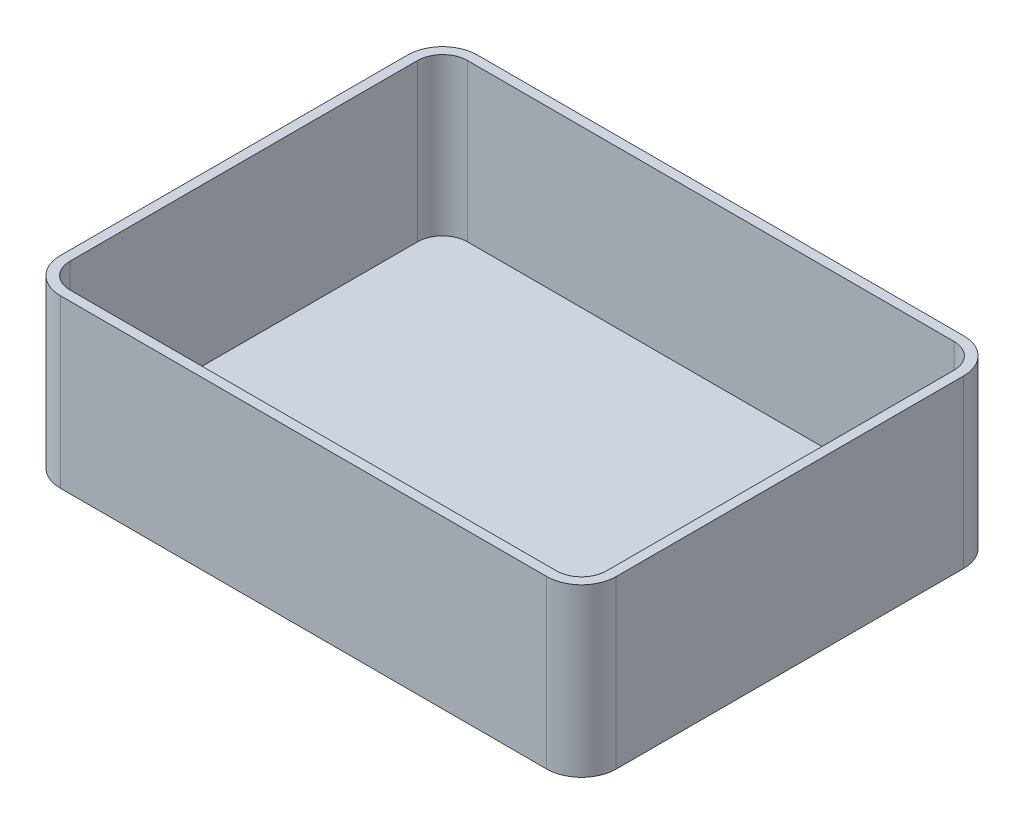
ISO-10303-21;
HEADER;
FILE_DESCRIPTION(('STEP AP214'),'2;1');
FILE_NAME('part.step','',(''),(''),'','','');
FILE_SCHEMA(('AUTOMOTIVE_DESIGN { 1 0 10303 214 1 1 1 1 }'));
ENDSEC;
DATA;
#1=APPLICATION_CONTEXT('core data for automotive mechanical design processes');
#2=APPLICATION_PROTOCOL_DEFINITION('international standard','automotive_design',2000,#1);
#3=PRODUCT_CONTEXT('',#1,'mechanical');
#4=PRODUCT('Part','Part','',(#3));
#5=PRODUCT_RELATED_PRODUCT_CATEGORY('part','',(#4));
#6=PRODUCT_DEFINITION_FORMATION('','',#4);
#7=PRODUCT_DEFINITION_CONTEXT('part definition',#1,'design');
#8=PRODUCT_DEFINITION('design','',#6,#7);
#9=PRODUCT_DEFINITION_SHAPE('','',#8);
#10=(LENGTH_UNIT() NAMED_UNIT(*) SI_UNIT(.MILLI.,.METRE.));
#11=(NAMED_UNIT(*) PLANE_ANGLE_UNIT() SI_UNIT($,.RADIAN.));
#12=(NAMED_UNIT(*) SI_UNIT($,.STERADIAN.) SOLID_ANGLE_UNIT());
#13=UNCERTAINTY_MEASURE_WITH_UNIT(LENGTH_MEASURE(1.E-05),#10,'distance_accuracy_value','');
#14=(GEOMETRIC_REPRESENTATION_CONTEXT(3) GLOBAL_UNCERTAINTY_ASSIGNED_CONTEXT((#13)) GLOBAL_UNIT_ASSIGNED_CONTEXT((#10,
#11,#12)) REPRESENTATION_CONTEXT('',''));
#15=CARTESIAN_POINT('',(0.,0.,0.));
#16=DIRECTION('',(0.,0.,1.));
#17=DIRECTION('',(1.,0.,0.));
#18=AXIS2_PLACEMENT_3D('',#15,#16,#17);
#19=CARTESIAN_POINT('',(175.,120.,-125.));
#20=DIRECTION('',(0.,-1.,0.));
#21=DIRECTION('',(0.,0.,-1.));
#22=AXIS2_PLACEMENT_3D('',#19,#20,#21);
#23=PLANE('',#22);
#24=CARTESIAN_POINT('',(175.,120.,-125.));
#25=DIRECTION('',(0.,1.,0.));
#26=DIRECTION('',(0.,0.,-1.));
#27=AXIS2_PLACEMENT_3D('',#24,#25,#26);
#28=CIRCLE('',#27,25.);
#29=CARTESIAN_POINT('',(200.,120.,-125.));
#30=VERTEX_POINT('',#29);
#31=CARTESIAN_POINT('',(175.,120.,-150.));
#32=VERTEX_POINT('',#31);
#33=EDGE_CURVE('E161',#30,#32,#28,.T.);
#34=ORIENTED_EDGE('',*,*,#33,.T.);
#35=DIRECTION('',(-1.,0.,0.));
#36=VECTOR('',#35,1.);
#37=CARTESIAN_POINT('',(-175.,120.,-150.));
#38=LINE('',#37,#36);
#39=CARTESIAN_POINT('',(-175.,120.,-150.));
#40=VERTEX_POINT('',#39);
#41=EDGE_CURVE('E102',#32,#40,#38,.T.);
#42=ORIENTED_EDGE('',*,*,#41,.T.);
#43=CARTESIAN_POINT('',(-175.,120.,-125.));
#44=DIRECTION('',(0.,1.,0.));
#45=DIRECTION('',(0.,0.,-1.));
#46=AXIS2_PLACEMENT_3D('',#43,#44,#45);
#47=CIRCLE('',#46,25.);
#48=CARTESIAN_POINT('',(-200.,120.,-125.));
#49=VERTEX_POINT('',#48);
#50=EDGE_CURVE('E176',#40,#49,#47,.T.);
#51=ORIENTED_EDGE('',*,*,#50,.T.);
#52=DIRECTION('',(0.,0.,1.));
#53=VECTOR('',#52,1.);
#54=CARTESIAN_POINT('',(-200.,120.,125.));
#55=LINE('',#54,#53);
#56=CARTESIAN_POINT('',(-200.,120.,125.));
#57=VERTEX_POINT('',#56);
#58=EDGE_CURVE('E188',#49,#57,#55,.T.);
#59=ORIENTED_EDGE('',*,*,#58,.T.);
#60=CARTESIAN_POINT('',(-175.,120.,125.));
#61=DIRECTION('',(0.,1.,0.));
#62=DIRECTION('',(0.,0.,-1.));
#63=AXIS2_PLACEMENT_3D('',#60,#61,#62);
#64=CIRCLE('',#63,25.);
#65=CARTESIAN_POINT('',(-175.,120.,150.));
#66=VERTEX_POINT('',#65);
#67=EDGE_CURVE('E124',#57,#66,#64,.T.);
#68=ORIENTED_EDGE('',*,*,#67,.T.);
#69=DIRECTION('',(1.,0.,0.));
#70=VECTOR('',#69,1.);
#71=CARTESIAN_POINT('',(-175.,120.,150.));
#72=LINE('',#71,#70);
#73=CARTESIAN_POINT('',(175.,120.,150.));
#74=VERTEX_POINT('',#73);
#75=EDGE_CURVE('E117',#66,#74,#72,.T.);
#76=ORIENTED_EDGE('',*,*,#75,.T.);
#77=CARTESIAN_POINT('',(175.,120.,125.));
#78=DIRECTION('',(0.,1.,0.));
#79=DIRECTION('',(0.,0.,1.));
#80=AXIS2_PLACEMENT_3D('',#77,#78,#79);
#81=CIRCLE('',#80,25.);
#82=CARTESIAN_POINT('',(200.,120.,125.));
#83=VERTEX_POINT('',#82);
#84=EDGE_CURVE('E121',#74,#83,#81,.T.);
#85=ORIENTED_EDGE('',*,*,#84,.T.);
#86=DIRECTION('',(0.,0.,-1.));
#87=VECTOR('',#86,1.);
#88=CARTESIAN_POINT('',(200.,120.,125.));
#89=LINE('',#88,#87);
#90=EDGE_CURVE('E61',#83,#30,#89,.T.);
#91=ORIENTED_EDGE('',*,*,#90,.T.);
#92=EDGE_LOOP('',(#34,#42,#51,#59,#68,#76,#85,#91));
#93=FACE_BOUND('',#92,.T.);
#94=CARTESIAN_POINT('',(175.,120.,-125.));
#95=DIRECTION('',(0.,-1.,0.));
#96=DIRECTION('',(0.,0.,-1.));
#97=AXIS2_PLACEMENT_3D('',#94,#95,#96);
#98=CIRCLE('',#97,18.);
#99=CARTESIAN_POINT('',(193.,120.,-125.));
#100=VERTEX_POINT('',#99);
#101=CARTESIAN_POINT('',(175.,120.,-143.));
#102=VERTEX_POINT('',#101);
#103=EDGE_CURVE('E214',#100,#102,#98,.F.);
#104=ORIENTED_EDGE('',*,*,#103,.F.);
#105=DIRECTION('',(0.,0.,-1.));
#106=VECTOR('',#105,1.);
#107=CARTESIAN_POINT('',(193.,120.,-125.));
#108=LINE('',#107,#106);
#109=CARTESIAN_POINT('',(193.,120.,125.));
#110=VERTEX_POINT('',#109);
#111=EDGE_CURVE('E194',#110,#100,#108,.T.);
#112=ORIENTED_EDGE('',*,*,#111,.F.);
#113=CARTESIAN_POINT('',(175.,120.,125.));
#114=DIRECTION('',(0.,-1.,0.));
#115=DIRECTION('',(0.,0.,-1.));
#116=AXIS2_PLACEMENT_3D('',#113,#114,#115);
#117=CIRCLE('',#116,18.);
#118=CARTESIAN_POINT('',(175.,120.,143.));
#119=VERTEX_POINT('',#118);
#120=EDGE_CURVE('E197',#119,#110,#117,.F.);
#121=ORIENTED_EDGE('',*,*,#120,.F.);
#122=DIRECTION('',(1.,0.,0.));
#123=VECTOR('',#122,1.);
#124=CARTESIAN_POINT('',(175.,120.,143.));
#125=LINE('',#124,#123);
#126=CARTESIAN_POINT('',(-175.,120.,143.));
#127=VERTEX_POINT('',#126);
#128=EDGE_CURVE('E199',#127,#119,#125,.T.);
#129=ORIENTED_EDGE('',*,*,#128,.F.);
#130=CARTESIAN_POINT('',(-175.,120.,125.));
#131=DIRECTION('',(0.,-1.,0.));
#132=DIRECTION('',(0.,0.,-1.));
#133=AXIS2_PLACEMENT_3D('',#130,#131,#132);
#134=CIRCLE('',#133,18.);
#135=CARTESIAN_POINT('',(-193.,120.,125.));
#136=VERTEX_POINT('',#135);
#137=EDGE_CURVE('E202',#136,#127,#134,.F.);
#138=ORIENTED_EDGE('',*,*,#137,.F.);
#139=DIRECTION('',(0.,0.,1.));
#140=VECTOR('',#139,1.);
#141=CARTESIAN_POINT('',(-193.,120.,-125.));
#142=LINE('',#141,#140);
#143=CARTESIAN_POINT('',(-193.,120.,-125.));
#144=VERTEX_POINT('',#143);
#145=EDGE_CURVE('E205',#144,#136,#142,.T.);
#146=ORIENTED_EDGE('',*,*,#145,.F.);
#147=CARTESIAN_POINT('',(-175.,120.,-125.));
#148=DIRECTION('',(0.,-1.,0.));
#149=DIRECTION('',(0.,0.,-1.));
#150=AXIS2_PLACEMENT_3D('',#147,#148,#149);
#151=CIRCLE('',#150,18.);
#152=CARTESIAN_POINT('',(-175.,120.,-143.));
#153=VERTEX_POINT('',#152);
#154=EDGE_CURVE('E208',#153,#144,#151,.F.);
#155=ORIENTED_EDGE('',*,*,#154,.F.);
#156=DIRECTION('',(-1.,0.,0.));
#157=VECTOR('',#156,1.);
#158=CARTESIAN_POINT('',(175.,120.,-143.));
#159=LINE('',#158,#157);
#160=EDGE_CURVE('E211',#102,#153,#159,.T.);
#161=ORIENTED_EDGE('',*,*,#160,.F.);
#162=EDGE_LOOP('',(#104,#112,#121,#129,#138,#146,#155,#161));
#163=FACE_BOUND('',#162,.T.);
#164=ADVANCED_FACE('F37',(#93,#163),#23,.F.);
#165=CARTESIAN_POINT('',(175.,120.,-125.));
#166=DIRECTION('',(0.,-1.,0.));
#167=DIRECTION('',(0.,0.,-1.));
#168=AXIS2_PLACEMENT_3D('',#165,#166,#167);
#169=CYLINDRICAL_SURFACE('',#168,25.);
#170=CARTESIAN_POINT('',(175.,0.,-125.));
#171=DIRECTION('',(0.,1.,0.));
#172=DIRECTION('',(0.,0.,-1.));
#173=AXIS2_PLACEMENT_3D('',#170,#171,#172);
#174=CIRCLE('',#173,25.);
#175=CARTESIAN_POINT('',(200.,0.,-125.));
#176=VERTEX_POINT('',#175);
#177=CARTESIAN_POINT('',(175.,0.,-150.));
#178=VERTEX_POINT('',#177);
#179=EDGE_CURVE('E145',#176,#178,#174,.T.);
#180=ORIENTED_EDGE('',*,*,#179,.T.);
#181=DIRECTION('',(0.,-1.,0.));
#182=VECTOR('',#181,1.);
#183=CARTESIAN_POINT('',(175.,120.,-150.));
#184=LINE('',#183,#182);
#185=EDGE_CURVE('E11',#32,#178,#184,.T.);
#186=ORIENTED_EDGE('',*,*,#185,.F.);
#187=ORIENTED_EDGE('',*,*,#33,.F.);
#188=DIRECTION('',(0.,-1.,0.));
#189=VECTOR('',#188,1.);
#190=CARTESIAN_POINT('',(200.,120.,-125.));
#191=LINE('',#190,#189);
#192=EDGE_CURVE('E141',#30,#176,#191,.T.);
#193=ORIENTED_EDGE('',*,*,#192,.T.);
#194=EDGE_LOOP('',(#180,#186,#187,#193));
#195=FACE_BOUND('',#194,.T.);
#196=ADVANCED_FACE('F39',(#195),#169,.T.);
#197=CARTESIAN_POINT('',(-175.,120.,-150.));
#198=DIRECTION('',(0.,0.,1.));
#199=DIRECTION('',(1.,0.,0.));
#200=AXIS2_PLACEMENT_3D('',#197,#198,#199);
#201=PLANE('',#200);
#202=DIRECTION('',(-1.,0.,0.));
#203=VECTOR('',#202,1.);
#204=CARTESIAN_POINT('',(-175.,0.,-150.));
#205=LINE('',#204,#203);
#206=CARTESIAN_POINT('',(-175.,0.,-150.));
#207=VERTEX_POINT('',#206);
#208=EDGE_CURVE('E148',#178,#207,#205,.T.);
#209=ORIENTED_EDGE('',*,*,#208,.T.);
#210=DIRECTION('',(0.,-1.,0.));
#211=VECTOR('',#210,1.);
#212=CARTESIAN_POINT('',(-175.,120.,-150.));
#213=LINE('',#212,#211);
#214=EDGE_CURVE('E45',#40,#207,#213,.T.);
#215=ORIENTED_EDGE('',*,*,#214,.F.);
#216=ORIENTED_EDGE('',*,*,#41,.F.);
#217=ORIENTED_EDGE('',*,*,#185,.T.);
#218=EDGE_LOOP('',(#209,#215,#216,#217));
#219=FACE_BOUND('',#218,.T.);
#220=ADVANCED_FACE('F333',(#219),#201,.F.);
#221=CARTESIAN_POINT('',(-175.,120.,-125.));
#222=DIRECTION('',(0.,-1.,0.));
#223=DIRECTION('',(0.,0.,-1.));
#224=AXIS2_PLACEMENT_3D('',#221,#222,#223);
#225=CYLINDRICAL_SURFACE('',#224,25.);
#226=CARTESIAN_POINT('',(-175.,0.,-125.));
#227=DIRECTION('',(0.,1.,0.));
#228=DIRECTION('',(0.,0.,-1.));
#229=AXIS2_PLACEMENT_3D('',#226,#227,#228);
#230=CIRCLE('',#229,25.);
#231=CARTESIAN_POINT('',(-200.,0.,-125.));
#232=VERTEX_POINT('',#231);
#233=EDGE_CURVE('E151',#207,#232,#230,.T.);
#234=ORIENTED_EDGE('',*,*,#233,.T.);
#235=DIRECTION('',(0.,-1.,0.));
#236=VECTOR('',#235,1.);
#237=CARTESIAN_POINT('',(-200.,120.,-125.));
#238=LINE('',#237,#236);
#239=EDGE_CURVE('E168',#49,#232,#238,.T.);
#240=ORIENTED_EDGE('',*,*,#239,.F.);
#241=ORIENTED_EDGE('',*,*,#50,.F.);
#242=ORIENTED_EDGE('',*,*,#214,.T.);
#243=EDGE_LOOP('',(#234,#240,#241,#242));
#244=FACE_BOUND('',#243,.T.);
#245=ADVANCED_FACE('F174',(#244),#225,.T.);
#246=CARTESIAN_POINT('',(-200.,120.,125.));
#247=DIRECTION('',(1.,0.,0.));
#248=DIRECTION('',(0.,0.,-1.));
#249=AXIS2_PLACEMENT_3D('',#246,#247,#248);
#250=PLANE('',#249);
#251=DIRECTION('',(0.,0.,1.));
#252=VECTOR('',#251,1.);
#253=CARTESIAN_POINT('',(-200.,0.,125.));
#254=LINE('',#253,#252);
#255=CARTESIAN_POINT('',(-200.,0.,125.));
#256=VERTEX_POINT('',#255);
#257=EDGE_CURVE('E153',#232,#256,#254,.T.);
#258=ORIENTED_EDGE('',*,*,#257,.T.);
#259=DIRECTION('',(0.,-1.,0.));
#260=VECTOR('',#259,1.);
#261=CARTESIAN_POINT('',(-200.,120.,125.));
#262=LINE('',#261,#260);
#263=EDGE_CURVE('E165',#57,#256,#262,.T.);
#264=ORIENTED_EDGE('',*,*,#263,.F.);
#265=ORIENTED_EDGE('',*,*,#58,.F.);
#266=ORIENTED_EDGE('',*,*,#239,.T.);
#267=EDGE_LOOP('',(#258,#264,#265,#266));
#268=FACE_BOUND('',#267,.T.);
#269=ADVANCED_FACE('F184',(#268),#250,.F.);
#270=CARTESIAN_POINT('',(-175.,120.,125.));
#271=DIRECTION('',(0.,-1.,0.));
#272=DIRECTION('',(0.,0.,-1.));
#273=AXIS2_PLACEMENT_3D('',#270,#271,#272);
#274=CYLINDRICAL_SURFACE('',#273,25.);
#275=CARTESIAN_POINT('',(-175.,0.,125.));
#276=DIRECTION('',(0.,1.,0.));
#277=DIRECTION('',(0.,0.,-1.));
#278=AXIS2_PLACEMENT_3D('',#275,#276,#277);
#279=CIRCLE('',#278,25.);
#280=CARTESIAN_POINT('',(-175.,0.,150.));
#281=VERTEX_POINT('',#280);
#282=EDGE_CURVE('E155',#256,#281,#279,.T.);
#283=ORIENTED_EDGE('',*,*,#282,.T.);
#284=DIRECTION('',(0.,-1.,0.));
#285=VECTOR('',#284,1.);
#286=CARTESIAN_POINT('',(-175.,120.,150.));
#287=LINE('',#286,#285);
#288=EDGE_CURVE('E136',#66,#281,#287,.T.);
#289=ORIENTED_EDGE('',*,*,#288,.F.);
#290=ORIENTED_EDGE('',*,*,#67,.F.);
#291=ORIENTED_EDGE('',*,*,#263,.T.);
#292=EDGE_LOOP('',(#283,#289,#290,#291));
#293=FACE_BOUND('',#292,.T.);
#294=ADVANCED_FACE('F187',(#293),#274,.T.);
#295=CARTESIAN_POINT('',(-175.,120.,150.));
#296=DIRECTION('',(0.,0.,-1.));
#297=DIRECTION('',(-1.,0.,0.));
#298=AXIS2_PLACEMENT_3D('',#295,#296,#297);
#299=PLANE('',#298);
#300=DIRECTION('',(1.,0.,0.));
#301=VECTOR('',#300,1.);
#302=CARTESIAN_POINT('',(-175.,0.,150.));
#303=LINE('',#302,#301);
#304=CARTESIAN_POINT('',(175.,0.,150.));
#305=VERTEX_POINT('',#304);
#306=EDGE_CURVE('E133',#281,#305,#303,.T.);
#307=ORIENTED_EDGE('',*,*,#306,.T.);
#308=DIRECTION('',(0.,-1.,0.));
#309=VECTOR('',#308,1.);
#310=CARTESIAN_POINT('',(175.,120.,150.));
#311=LINE('',#310,#309);
#312=EDGE_CURVE('E130',#74,#305,#311,.T.);
#313=ORIENTED_EDGE('',*,*,#312,.F.);
#314=ORIENTED_EDGE('',*,*,#75,.F.);
#315=ORIENTED_EDGE('',*,*,#288,.T.);
#316=EDGE_LOOP('',(#307,#313,#314,#315));
#317=FACE_BOUND('',#316,.T.);
#318=ADVANCED_FACE('F131',(#317),#299,.F.);
#319=CARTESIAN_POINT('',(175.,120.,125.));
#320=DIRECTION('',(0.,-1.,0.));
#321=DIRECTION('',(0.,0.,-1.));
#322=AXIS2_PLACEMENT_3D('',#319,#320,#321);
#323=CYLINDRICAL_SURFACE('',#322,25.);
#324=CARTESIAN_POINT('',(175.,0.,125.));
#325=DIRECTION('',(0.,1.,0.));
#326=DIRECTION('',(0.,0.,1.));
#327=AXIS2_PLACEMENT_3D('',#324,#325,#326);
#328=CIRCLE('',#327,25.);
#329=CARTESIAN_POINT('',(200.,0.,125.));
#330=VERTEX_POINT('',#329);
#331=EDGE_CURVE('E158',#305,#330,#328,.T.);
#332=ORIENTED_EDGE('',*,*,#331,.T.);
#333=DIRECTION('',(0.,-1.,0.));
#334=VECTOR('',#333,1.);
#335=CARTESIAN_POINT('',(200.,120.,125.));
#336=LINE('',#335,#334);
#337=EDGE_CURVE('E137',#83,#330,#336,.T.);
#338=ORIENTED_EDGE('',*,*,#337,.F.);
#339=ORIENTED_EDGE('',*,*,#84,.F.);
#340=ORIENTED_EDGE('',*,*,#312,.T.);
#341=EDGE_LOOP('',(#332,#338,#339,#340));
#342=FACE_BOUND('',#341,.T.);
#343=ADVANCED_FACE('F139',(#342),#323,.T.);
#344=CARTESIAN_POINT('',(200.,120.,125.));
#345=DIRECTION('',(-1.,0.,0.));
#346=DIRECTION('',(0.,0.,1.));
#347=AXIS2_PLACEMENT_3D('',#344,#345,#346);
#348=PLANE('',#347);
#349=DIRECTION('',(0.,0.,-1.));
#350=VECTOR('',#349,1.);
#351=CARTESIAN_POINT('',(200.,0.,125.));
#352=LINE('',#351,#350);
#353=EDGE_CURVE('E94',#330,#176,#352,.T.);
#354=ORIENTED_EDGE('',*,*,#353,.T.);
#355=ORIENTED_EDGE('',*,*,#192,.F.);
#356=ORIENTED_EDGE('',*,*,#90,.F.);
#357=ORIENTED_EDGE('',*,*,#337,.T.);
#358=EDGE_LOOP('',(#354,#355,#356,#357));
#359=FACE_BOUND('',#358,.T.);
#360=ADVANCED_FACE('F339',(#359),#348,.F.);
#361=CARTESIAN_POINT('',(175.,0.,-125.));
#362=DIRECTION('',(0.,-1.,0.));
#363=DIRECTION('',(0.,0.,-1.));
#364=AXIS2_PLACEMENT_3D('',#361,#362,#363);
#365=PLANE('',#364);
#366=ORIENTED_EDGE('',*,*,#179,.F.);
#367=ORIENTED_EDGE('',*,*,#353,.F.);
#368=ORIENTED_EDGE('',*,*,#331,.F.);
#369=ORIENTED_EDGE('',*,*,#306,.F.);
#370=ORIENTED_EDGE('',*,*,#282,.F.);
#371=ORIENTED_EDGE('',*,*,#257,.F.);
#372=ORIENTED_EDGE('',*,*,#233,.F.);
#373=ORIENTED_EDGE('',*,*,#208,.F.);
#374=EDGE_LOOP('',(#366,#367,#368,#369,#370,#371,#372,#373));
#375=FACE_BOUND('',#374,.T.);
#376=ADVANCED_FACE('F180',(#375),#365,.T.);
#377=CARTESIAN_POINT('',(175.,120.,-125.));
#378=DIRECTION('',(0.,-1.,0.));
#379=DIRECTION('',(0.,0.,-1.));
#380=AXIS2_PLACEMENT_3D('',#377,#378,#379);
#381=CYLINDRICAL_SURFACE('',#380,18.);
#382=CARTESIAN_POINT('',(175.,7.00000000000001,-125.));
#383=DIRECTION('',(0.,-1.,0.));
#384=DIRECTION('',(0.,0.,-1.));
#385=AXIS2_PLACEMENT_3D('',#382,#383,#384);
#386=CIRCLE('',#385,18.);
#387=CARTESIAN_POINT('',(193.,7.00000000000001,-125.));
#388=VERTEX_POINT('',#387);
#389=CARTESIAN_POINT('',(175.,7.00000000000001,-143.));
#390=VERTEX_POINT('',#389);
#391=EDGE_CURVE('E254',#388,#390,#386,.F.);
#392=ORIENTED_EDGE('',*,*,#391,.F.);
#393=DIRECTION('',(0.,-1.,0.));
#394=VECTOR('',#393,1.);
#395=CARTESIAN_POINT('',(193.,120.,-125.));
#396=LINE('',#395,#394);
#397=EDGE_CURVE('E196',#100,#388,#396,.T.);
#398=ORIENTED_EDGE('',*,*,#397,.F.);
#399=ORIENTED_EDGE('',*,*,#103,.T.);
#400=DIRECTION('',(0.,1.,0.));
#401=VECTOR('',#400,1.);
#402=CARTESIAN_POINT('',(175.,120.,-143.));
#403=LINE('',#402,#401);
#404=EDGE_CURVE('E149',#102,#390,#403,.F.);
#405=ORIENTED_EDGE('',*,*,#404,.T.);
#406=EDGE_LOOP('',(#392,#398,#399,#405));
#407=FACE_BOUND('',#406,.T.);
#408=ADVANCED_FACE('F270',(#407),#381,.F.);
#409=CARTESIAN_POINT('',(-175.,120.,-143.));
#410=DIRECTION('',(0.,0.,1.));
#411=DIRECTION('',(1.,0.,0.));
#412=AXIS2_PLACEMENT_3D('',#409,#410,#411);
#413=PLANE('',#412);
#414=DIRECTION('',(-1.,0.,0.));
#415=VECTOR('',#414,1.);
#416=CARTESIAN_POINT('',(175.,7.,-143.));
#417=LINE('',#416,#415);
#418=CARTESIAN_POINT('',(-175.,7.00000000000001,-143.));
#419=VERTEX_POINT('',#418);
#420=EDGE_CURVE('E249',#390,#419,#417,.T.);
#421=ORIENTED_EDGE('',*,*,#420,.F.);
#422=ORIENTED_EDGE('',*,*,#404,.F.);
#423=ORIENTED_EDGE('',*,*,#160,.T.);
#424=DIRECTION('',(0.,-1.,0.));
#425=VECTOR('',#424,1.);
#426=CARTESIAN_POINT('',(-175.,120.,-143.));
#427=LINE('',#426,#425);
#428=EDGE_CURVE('E246',#153,#419,#427,.T.);
#429=ORIENTED_EDGE('',*,*,#428,.T.);
#430=EDGE_LOOP('',(#421,#422,#423,#429));
#431=FACE_BOUND('',#430,.T.);
#432=ADVANCED_FACE('F299',(#431),#413,.T.);
#433=CARTESIAN_POINT('',(-175.,120.,-125.));
#434=DIRECTION('',(0.,-1.,0.));
#435=DIRECTION('',(0.,0.,-1.));
#436=AXIS2_PLACEMENT_3D('',#433,#434,#435);
#437=CYLINDRICAL_SURFACE('',#436,18.);
#438=CARTESIAN_POINT('',(-175.,7.00000000000001,-125.));
#439=DIRECTION('',(0.,-1.,0.));
#440=DIRECTION('',(0.,0.,-1.));
#441=AXIS2_PLACEMENT_3D('',#438,#439,#440);
#442=CIRCLE('',#441,18.);
#443=CARTESIAN_POINT('',(-193.,7.00000000000001,-125.));
#444=VERTEX_POINT('',#443);
#445=EDGE_CURVE('E243',#419,#444,#442,.F.);
#446=ORIENTED_EDGE('',*,*,#445,.F.);
#447=ORIENTED_EDGE('',*,*,#428,.F.);
#448=ORIENTED_EDGE('',*,*,#154,.T.);
#449=DIRECTION('',(0.,1.,0.));
#450=VECTOR('',#449,1.);
#451=CARTESIAN_POINT('',(-193.,120.,-125.));
#452=LINE('',#451,#450);
#453=EDGE_CURVE('E240',#144,#444,#452,.F.);
#454=ORIENTED_EDGE('',*,*,#453,.T.);
#455=EDGE_LOOP('',(#446,#447,#448,#454));
#456=FACE_BOUND('',#455,.T.);
#457=ADVANCED_FACE('F305',(#456),#437,.F.);
#458=CARTESIAN_POINT('',(-193.,120.,125.));
#459=DIRECTION('',(1.,0.,0.));
#460=DIRECTION('',(0.,0.,-1.));
#461=AXIS2_PLACEMENT_3D('',#458,#459,#460);
#462=PLANE('',#461);
#463=DIRECTION('',(0.,0.,1.));
#464=VECTOR('',#463,1.);
#465=CARTESIAN_POINT('',(-193.,7.,-125.));
#466=LINE('',#465,#464);
#467=CARTESIAN_POINT('',(-193.,7.00000000000001,125.));
#468=VERTEX_POINT('',#467);
#469=EDGE_CURVE('E237',#444,#468,#466,.T.);
#470=ORIENTED_EDGE('',*,*,#469,.F.);
#471=ORIENTED_EDGE('',*,*,#453,.F.);
#472=ORIENTED_EDGE('',*,*,#145,.T.);
#473=DIRECTION('',(0.,-1.,0.));
#474=VECTOR('',#473,1.);
#475=CARTESIAN_POINT('',(-193.,120.,125.));
#476=LINE('',#475,#474);
#477=EDGE_CURVE('E234',#136,#468,#476,.T.);
#478=ORIENTED_EDGE('',*,*,#477,.T.);
#479=EDGE_LOOP('',(#470,#471,#472,#478));
#480=FACE_BOUND('',#479,.T.);
#481=ADVANCED_FACE('F404',(#480),#462,.T.);
#482=CARTESIAN_POINT('',(-175.,120.,125.));
#483=DIRECTION('',(0.,-1.,0.));
#484=DIRECTION('',(0.,0.,-1.));
#485=AXIS2_PLACEMENT_3D('',#482,#483,#484);
#486=CYLINDRICAL_SURFACE('',#485,18.);
#487=CARTESIAN_POINT('',(-175.,7.00000000000001,125.));
#488=DIRECTION('',(0.,-1.,0.));
#489=DIRECTION('',(0.,0.,-1.));
#490=AXIS2_PLACEMENT_3D('',#487,#488,#489);
#491=CIRCLE('',#490,18.);
#492=CARTESIAN_POINT('',(-175.,7.00000000000001,143.));
#493=VERTEX_POINT('',#492);
#494=EDGE_CURVE('E231',#468,#493,#491,.F.);
#495=ORIENTED_EDGE('',*,*,#494,.F.);
#496=ORIENTED_EDGE('',*,*,#477,.F.);
#497=ORIENTED_EDGE('',*,*,#137,.T.);
#498=DIRECTION('',(0.,1.,0.));
#499=VECTOR('',#498,1.);
#500=CARTESIAN_POINT('',(-175.,120.,143.));
#501=LINE('',#500,#499);
#502=EDGE_CURVE('E228',#127,#493,#501,.F.);
#503=ORIENTED_EDGE('',*,*,#502,.T.);
#504=EDGE_LOOP('',(#495,#496,#497,#503));
#505=FACE_BOUND('',#504,.T.);
#506=ADVANCED_FACE('F326',(#505),#486,.F.);
#507=CARTESIAN_POINT('',(-175.,120.,143.));
#508=DIRECTION('',(0.,0.,-1.));
#509=DIRECTION('',(-1.,0.,0.));
#510=AXIS2_PLACEMENT_3D('',#507,#508,#509);
#511=PLANE('',#510);
#512=DIRECTION('',(1.,0.,0.));
#513=VECTOR('',#512,1.);
#514=CARTESIAN_POINT('',(175.,7.,143.));
#515=LINE('',#514,#513);
#516=CARTESIAN_POINT('',(175.,7.00000000000001,143.));
#517=VERTEX_POINT('',#516);
#518=EDGE_CURVE('E225',#493,#517,#515,.T.);
#519=ORIENTED_EDGE('',*,*,#518,.F.);
#520=ORIENTED_EDGE('',*,*,#502,.F.);
#521=ORIENTED_EDGE('',*,*,#128,.T.);
#522=DIRECTION('',(0.,-1.,0.));
#523=VECTOR('',#522,1.);
#524=CARTESIAN_POINT('',(175.,120.,143.));
#525=LINE('',#524,#523);
#526=EDGE_CURVE('E222',#119,#517,#525,.T.);
#527=ORIENTED_EDGE('',*,*,#526,.T.);
#528=EDGE_LOOP('',(#519,#520,#521,#527));
#529=FACE_BOUND('',#528,.T.);
#530=ADVANCED_FACE('F316',(#529),#511,.T.);
#531=CARTESIAN_POINT('',(175.,120.,125.));
#532=DIRECTION('',(0.,-1.,0.));
#533=DIRECTION('',(0.,0.,-1.));
#534=AXIS2_PLACEMENT_3D('',#531,#532,#533);
#535=CYLINDRICAL_SURFACE('',#534,18.);
#536=CARTESIAN_POINT('',(175.,7.00000000000001,125.));
#537=DIRECTION('',(0.,-1.,0.));
#538=DIRECTION('',(0.,0.,-1.));
#539=AXIS2_PLACEMENT_3D('',#536,#537,#538);
#540=CIRCLE('',#539,18.);
#541=CARTESIAN_POINT('',(193.,7.00000000000001,125.));
#542=VERTEX_POINT('',#541);
#543=EDGE_CURVE('E220',#517,#542,#540,.F.);
#544=ORIENTED_EDGE('',*,*,#543,.F.);
#545=ORIENTED_EDGE('',*,*,#526,.F.);
#546=ORIENTED_EDGE('',*,*,#120,.T.);
#547=DIRECTION('',(0.,1.,0.));
#548=VECTOR('',#547,1.);
#549=CARTESIAN_POINT('',(193.,120.,125.));
#550=LINE('',#549,#548);
#551=EDGE_CURVE('E52',#110,#542,#550,.F.);
#552=ORIENTED_EDGE('',*,*,#551,.T.);
#553=EDGE_LOOP('',(#544,#545,#546,#552));
#554=FACE_BOUND('',#553,.T.);
#555=ADVANCED_FACE('F318',(#554),#535,.F.);
#556=CARTESIAN_POINT('',(193.,120.,125.));
#557=DIRECTION('',(-1.,0.,0.));
#558=DIRECTION('',(0.,0.,1.));
#559=AXIS2_PLACEMENT_3D('',#556,#557,#558);
#560=PLANE('',#559);
#561=DIRECTION('',(0.,0.,-1.));
#562=VECTOR('',#561,1.);
#563=CARTESIAN_POINT('',(193.,7.,-125.));
#564=LINE('',#563,#562);
#565=EDGE_CURVE('E217',#542,#388,#564,.T.);
#566=ORIENTED_EDGE('',*,*,#565,.F.);
#567=ORIENTED_EDGE('',*,*,#551,.F.);
#568=ORIENTED_EDGE('',*,*,#111,.T.);
#569=ORIENTED_EDGE('',*,*,#397,.T.);
#570=EDGE_LOOP('',(#566,#567,#568,#569));
#571=FACE_BOUND('',#570,.T.);
#572=ADVANCED_FACE('F294',(#571),#560,.T.);
#573=CARTESIAN_POINT('',(175.,7.,-125.));
#574=DIRECTION('',(0.,-1.,0.));
#575=DIRECTION('',(0.,0.,-1.));
#576=AXIS2_PLACEMENT_3D('',#573,#574,#575);
#577=PLANE('',#576);
#578=ORIENTED_EDGE('',*,*,#391,.T.);
#579=ORIENTED_EDGE('',*,*,#420,.T.);
#580=ORIENTED_EDGE('',*,*,#445,.T.);
#581=ORIENTED_EDGE('',*,*,#469,.T.);
#582=ORIENTED_EDGE('',*,*,#494,.T.);
#583=ORIENTED_EDGE('',*,*,#518,.T.);
#584=ORIENTED_EDGE('',*,*,#543,.T.);
#585=ORIENTED_EDGE('',*,*,#565,.T.);
#586=EDGE_LOOP('',(#578,#579,#580,#581,#582,#583,#584,#585));
#587=FACE_BOUND('',#586,.T.);
#588=ADVANCED_FACE('F263',(#587),#577,.F.);
#589=CLOSED_SHELL('',(#164,#196,#220,#245,#269,#294,#318,#343,#360,#376,#408,#432,#457,#481,
#506,#530,#555,#572,#588));
#590=MANIFOLD_SOLID_BREP('B2',#589);
#591=ADVANCED_BREP_SHAPE_REPRESENTATION('',(#18,#590),#14);
#592=SHAPE_DEFINITION_REPRESENTATION(#9,#591);
ENDSEC;
END-ISO-10303-21;
